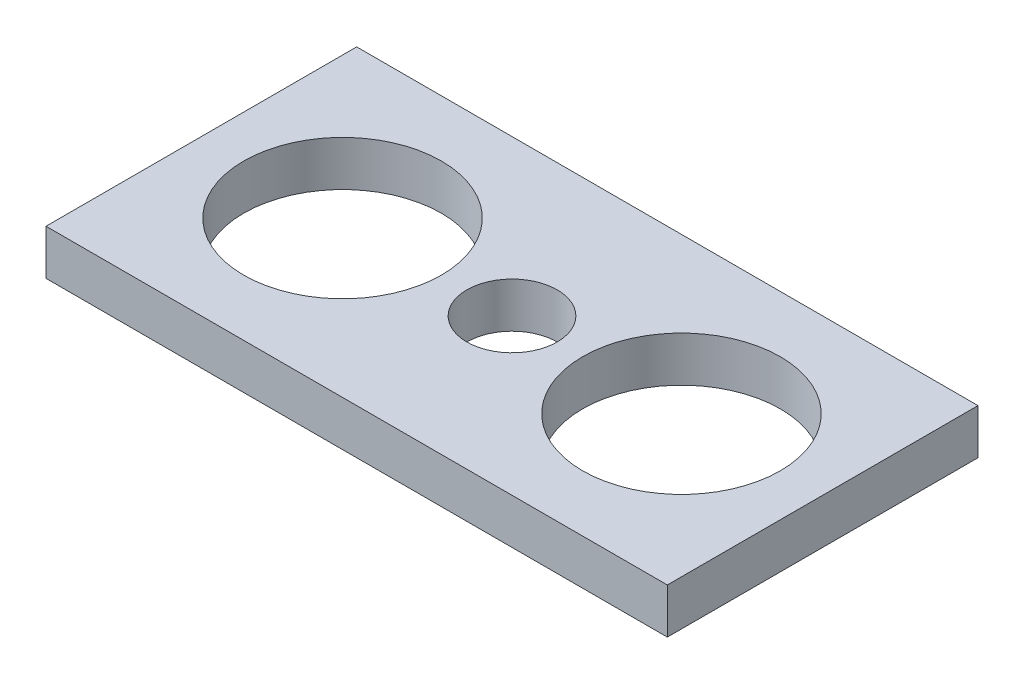
ISO-10303-21;
HEADER;
FILE_DESCRIPTION(('STEP AP214'),'2;1');
FILE_NAME('part.step','',(''),(''),'','','');
FILE_SCHEMA(('AUTOMOTIVE_DESIGN { 1 0 10303 214 1 1 1 1 }'));
ENDSEC;
DATA;
#1=APPLICATION_CONTEXT('core data for automotive mechanical design processes');
#2=APPLICATION_PROTOCOL_DEFINITION('international standard','automotive_design',2000,#1);
#3=PRODUCT_CONTEXT('',#1,'mechanical');
#4=PRODUCT('Part','Part','',(#3));
#5=PRODUCT_RELATED_PRODUCT_CATEGORY('part','',(#4));
#6=PRODUCT_DEFINITION_FORMATION('','',#4);
#7=PRODUCT_DEFINITION_CONTEXT('part definition',#1,'design');
#8=PRODUCT_DEFINITION('design','',#6,#7);
#9=PRODUCT_DEFINITION_SHAPE('','',#8);
#10=(LENGTH_UNIT() NAMED_UNIT(*) SI_UNIT(.MILLI.,.METRE.));
#11=(NAMED_UNIT(*) PLANE_ANGLE_UNIT() SI_UNIT($,.RADIAN.));
#12=(NAMED_UNIT(*) SI_UNIT($,.STERADIAN.) SOLID_ANGLE_UNIT());
#13=UNCERTAINTY_MEASURE_WITH_UNIT(LENGTH_MEASURE(1.E-05),#10,'distance_accuracy_value','');
#14=(GEOMETRIC_REPRESENTATION_CONTEXT(3) GLOBAL_UNCERTAINTY_ASSIGNED_CONTEXT((#13)) GLOBAL_UNIT_ASSIGNED_CONTEXT((#10,
#11,#12)) REPRESENTATION_CONTEXT('',''));
#15=CARTESIAN_POINT('',(0.,0.,0.));
#16=DIRECTION('',(0.,0.,1.));
#17=DIRECTION('',(1.,0.,0.));
#18=AXIS2_PLACEMENT_3D('',#15,#16,#17);
#19=CARTESIAN_POINT('',(0.,16.,-110.));
#20=DIRECTION('',(0.,-1.,0.));
#21=DIRECTION('',(0.,0.,-1.));
#22=AXIS2_PLACEMENT_3D('',#19,#20,#21);
#23=PLANE('',#22);
#24=CARTESIAN_POINT('',(170.,16.,-55.));
#25=DIRECTION('',(0.,1.,0.));
#26=DIRECTION('',(0.,0.,1.));
#27=AXIS2_PLACEMENT_3D('',#24,#25,#26);
#28=CIRCLE('',#27,35.);
#29=CARTESIAN_POINT('',(170.,16.,-20.));
#30=VERTEX_POINT('',#29);
#31=EDGE_CURVE('E114',#30,#30,#28,.T.);
#32=ORIENTED_EDGE('',*,*,#31,.F.);
#33=EDGE_LOOP('',(#32));
#34=FACE_BOUND('',#33,.T.);
#35=DIRECTION('',(0.,0.,1.));
#36=VECTOR('',#35,1.);
#37=CARTESIAN_POINT('',(0.,16.,0.));
#38=LINE('',#37,#36);
#39=CARTESIAN_POINT('',(0.,16.,-110.));
#40=VERTEX_POINT('',#39);
#41=CARTESIAN_POINT('',(0.,16.,0.));
#42=VERTEX_POINT('',#41);
#43=EDGE_CURVE('E84',#40,#42,#38,.T.);
#44=ORIENTED_EDGE('',*,*,#43,.T.);
#45=DIRECTION('',(1.,0.,0.));
#46=VECTOR('',#45,1.);
#47=CARTESIAN_POINT('',(0.,16.,0.));
#48=LINE('',#47,#46);
#49=CARTESIAN_POINT('',(220.,16.,0.));
#50=VERTEX_POINT('',#49);
#51=EDGE_CURVE('E79',#42,#50,#48,.T.);
#52=ORIENTED_EDGE('',*,*,#51,.T.);
#53=DIRECTION('',(0.,0.,-1.));
#54=VECTOR('',#53,1.);
#55=CARTESIAN_POINT('',(220.,16.,0.));
#56=LINE('',#55,#54);
#57=CARTESIAN_POINT('',(220.,16.,-110.));
#58=VERTEX_POINT('',#57);
#59=EDGE_CURVE('E82',#50,#58,#56,.T.);
#60=ORIENTED_EDGE('',*,*,#59,.T.);
#61=DIRECTION('',(-1.,0.,0.));
#62=VECTOR('',#61,1.);
#63=CARTESIAN_POINT('',(0.,16.,-110.));
#64=LINE('',#63,#62);
#65=EDGE_CURVE('E49',#58,#40,#64,.T.);
#66=ORIENTED_EDGE('',*,*,#65,.T.);
#67=EDGE_LOOP('',(#44,#52,#60,#66));
#68=FACE_BOUND('',#67,.T.);
#69=CARTESIAN_POINT('',(50.,16.,-55.));
#70=DIRECTION('',(0.,1.,0.));
#71=DIRECTION('',(0.,0.,1.));
#72=AXIS2_PLACEMENT_3D('',#69,#70,#71);
#73=CIRCLE('',#72,35.);
#74=CARTESIAN_POINT('',(50.,16.,-20.));
#75=VERTEX_POINT('',#74);
#76=EDGE_CURVE('E99',#75,#75,#73,.T.);
#77=ORIENTED_EDGE('',*,*,#76,.F.);
#78=EDGE_LOOP('',(#77));
#79=FACE_BOUND('',#78,.T.);
#80=CARTESIAN_POINT('',(110.,16.,-55.));
#81=DIRECTION('',(0.,1.,0.));
#82=DIRECTION('',(0.,0.,1.));
#83=AXIS2_PLACEMENT_3D('',#80,#81,#82);
#84=CIRCLE('',#83,16.);
#85=CARTESIAN_POINT('',(110.,16.,-39.));
#86=VERTEX_POINT('',#85);
#87=EDGE_CURVE('E120',#86,#86,#84,.T.);
#88=ORIENTED_EDGE('',*,*,#87,.F.);
#89=EDGE_LOOP('',(#88));
#90=FACE_BOUND('',#89,.T.);
#91=ADVANCED_FACE('F32',(#34,#68,#79,#90),#23,.F.);
#92=CARTESIAN_POINT('',(0.,0.,-110.));
#93=DIRECTION('',(0.,-1.,0.));
#94=DIRECTION('',(0.,0.,-1.));
#95=AXIS2_PLACEMENT_3D('',#92,#93,#94);
#96=PLANE('',#95);
#97=CARTESIAN_POINT('',(170.,0.,-55.));
#98=DIRECTION('',(0.,1.,0.));
#99=DIRECTION('',(0.,0.,1.));
#100=AXIS2_PLACEMENT_3D('',#97,#98,#99);
#101=CIRCLE('',#100,35.);
#102=CARTESIAN_POINT('',(170.,0.,-20.));
#103=VERTEX_POINT('',#102);
#104=EDGE_CURVE('E117',#103,#103,#101,.T.);
#105=ORIENTED_EDGE('',*,*,#104,.T.);
#106=EDGE_LOOP('',(#105));
#107=FACE_BOUND('',#106,.T.);
#108=DIRECTION('',(0.,0.,1.));
#109=VECTOR('',#108,1.);
#110=CARTESIAN_POINT('',(0.,0.,0.));
#111=LINE('',#110,#109);
#112=CARTESIAN_POINT('',(0.,0.,-110.));
#113=VERTEX_POINT('',#112);
#114=CARTESIAN_POINT('',(0.,0.,0.));
#115=VERTEX_POINT('',#114);
#116=EDGE_CURVE('E96',#113,#115,#111,.T.);
#117=ORIENTED_EDGE('',*,*,#116,.F.);
#118=DIRECTION('',(-1.,0.,0.));
#119=VECTOR('',#118,1.);
#120=CARTESIAN_POINT('',(0.,0.,-110.));
#121=LINE('',#120,#119);
#122=CARTESIAN_POINT('',(220.,0.,-110.));
#123=VERTEX_POINT('',#122);
#124=EDGE_CURVE('E72',#123,#113,#121,.T.);
#125=ORIENTED_EDGE('',*,*,#124,.F.);
#126=DIRECTION('',(0.,0.,-1.));
#127=VECTOR('',#126,1.);
#128=CARTESIAN_POINT('',(220.,0.,0.));
#129=LINE('',#128,#127);
#130=CARTESIAN_POINT('',(220.,0.,0.));
#131=VERTEX_POINT('',#130);
#132=EDGE_CURVE('E66',#131,#123,#129,.T.);
#133=ORIENTED_EDGE('',*,*,#132,.F.);
#134=DIRECTION('',(1.,0.,0.));
#135=VECTOR('',#134,1.);
#136=CARTESIAN_POINT('',(0.,0.,0.));
#137=LINE('',#136,#135);
#138=EDGE_CURVE('E88',#115,#131,#137,.T.);
#139=ORIENTED_EDGE('',*,*,#138,.F.);
#140=EDGE_LOOP('',(#117,#125,#133,#139));
#141=FACE_BOUND('',#140,.T.);
#142=CARTESIAN_POINT('',(50.,0.,-55.));
#143=DIRECTION('',(0.,1.,0.));
#144=DIRECTION('',(0.,0.,1.));
#145=AXIS2_PLACEMENT_3D('',#142,#143,#144);
#146=CIRCLE('',#145,35.);
#147=CARTESIAN_POINT('',(50.,0.,-20.));
#148=VERTEX_POINT('',#147);
#149=EDGE_CURVE('E111',#148,#148,#146,.T.);
#150=ORIENTED_EDGE('',*,*,#149,.T.);
#151=EDGE_LOOP('',(#150));
#152=FACE_BOUND('',#151,.T.);
#153=CARTESIAN_POINT('',(110.,0.,-55.));
#154=DIRECTION('',(0.,1.,0.));
#155=DIRECTION('',(0.,0.,1.));
#156=AXIS2_PLACEMENT_3D('',#153,#154,#155);
#157=CIRCLE('',#156,16.);
#158=CARTESIAN_POINT('',(110.,0.,-39.));
#159=VERTEX_POINT('',#158);
#160=EDGE_CURVE('E123',#159,#159,#157,.T.);
#161=ORIENTED_EDGE('',*,*,#160,.T.);
#162=EDGE_LOOP('',(#161));
#163=FACE_BOUND('',#162,.T.);
#164=ADVANCED_FACE('F107',(#107,#141,#152,#163),#96,.T.);
#165=CARTESIAN_POINT('',(0.,16.,0.));
#166=DIRECTION('',(1.,0.,0.));
#167=DIRECTION('',(0.,0.,-1.));
#168=AXIS2_PLACEMENT_3D('',#165,#166,#167);
#169=PLANE('',#168);
#170=ORIENTED_EDGE('',*,*,#116,.T.);
#171=DIRECTION('',(0.,-1.,0.));
#172=VECTOR('',#171,1.);
#173=CARTESIAN_POINT('',(0.,16.,0.));
#174=LINE('',#173,#172);
#175=EDGE_CURVE('E11',#42,#115,#174,.T.);
#176=ORIENTED_EDGE('',*,*,#175,.F.);
#177=ORIENTED_EDGE('',*,*,#43,.F.);
#178=DIRECTION('',(0.,-1.,0.));
#179=VECTOR('',#178,1.);
#180=CARTESIAN_POINT('',(0.,16.,-110.));
#181=LINE('',#180,#179);
#182=EDGE_CURVE('E92',#40,#113,#181,.T.);
#183=ORIENTED_EDGE('',*,*,#182,.T.);
#184=EDGE_LOOP('',(#170,#176,#177,#183));
#185=FACE_BOUND('',#184,.T.);
#186=ADVANCED_FACE('F34',(#185),#169,.F.);
#187=CARTESIAN_POINT('',(0.,16.,0.));
#188=DIRECTION('',(0.,0.,-1.));
#189=DIRECTION('',(-1.,0.,0.));
#190=AXIS2_PLACEMENT_3D('',#187,#188,#189);
#191=PLANE('',#190);
#192=ORIENTED_EDGE('',*,*,#138,.T.);
#193=DIRECTION('',(0.,-1.,0.));
#194=VECTOR('',#193,1.);
#195=CARTESIAN_POINT('',(220.,16.,0.));
#196=LINE('',#195,#194);
#197=EDGE_CURVE('E41',#50,#131,#196,.T.);
#198=ORIENTED_EDGE('',*,*,#197,.F.);
#199=ORIENTED_EDGE('',*,*,#51,.F.);
#200=ORIENTED_EDGE('',*,*,#175,.T.);
#201=EDGE_LOOP('',(#192,#198,#199,#200));
#202=FACE_BOUND('',#201,.T.);
#203=ADVANCED_FACE('F87',(#202),#191,.F.);
#204=CARTESIAN_POINT('',(220.,16.,0.));
#205=DIRECTION('',(-1.,0.,0.));
#206=DIRECTION('',(0.,0.,1.));
#207=AXIS2_PLACEMENT_3D('',#204,#205,#206);
#208=PLANE('',#207);
#209=ORIENTED_EDGE('',*,*,#132,.T.);
#210=DIRECTION('',(0.,-1.,0.));
#211=VECTOR('',#210,1.);
#212=CARTESIAN_POINT('',(220.,16.,-110.));
#213=LINE('',#212,#211);
#214=EDGE_CURVE('E89',#58,#123,#213,.T.);
#215=ORIENTED_EDGE('',*,*,#214,.F.);
#216=ORIENTED_EDGE('',*,*,#59,.F.);
#217=ORIENTED_EDGE('',*,*,#197,.T.);
#218=EDGE_LOOP('',(#209,#215,#216,#217));
#219=FACE_BOUND('',#218,.T.);
#220=ADVANCED_FACE('F90',(#219),#208,.F.);
#221=CARTESIAN_POINT('',(0.,16.,-110.));
#222=DIRECTION('',(0.,0.,1.));
#223=DIRECTION('',(1.,0.,0.));
#224=AXIS2_PLACEMENT_3D('',#221,#222,#223);
#225=PLANE('',#224);
#226=ORIENTED_EDGE('',*,*,#124,.T.);
#227=ORIENTED_EDGE('',*,*,#182,.F.);
#228=ORIENTED_EDGE('',*,*,#65,.F.);
#229=ORIENTED_EDGE('',*,*,#214,.T.);
#230=EDGE_LOOP('',(#226,#227,#228,#229));
#231=FACE_BOUND('',#230,.T.);
#232=ADVANCED_FACE('F104',(#231),#225,.F.);
#233=CARTESIAN_POINT('',(50.,16.,-55.));
#234=DIRECTION('',(0.,-1.,0.));
#235=DIRECTION('',(0.,0.,-1.));
#236=AXIS2_PLACEMENT_3D('',#233,#234,#235);
#237=CYLINDRICAL_SURFACE('',#236,35.);
#238=ORIENTED_EDGE('',*,*,#76,.T.);
#239=EDGE_LOOP('',(#238));
#240=FACE_BOUND('',#239,.T.);
#241=ORIENTED_EDGE('',*,*,#149,.F.);
#242=EDGE_LOOP('',(#241));
#243=FACE_BOUND('',#242,.T.);
#244=ADVANCED_FACE('F142',(#240,#243),#237,.F.);
#245=CARTESIAN_POINT('',(170.,16.,-55.));
#246=DIRECTION('',(0.,-1.,0.));
#247=DIRECTION('',(0.,0.,-1.));
#248=AXIS2_PLACEMENT_3D('',#245,#246,#247);
#249=CYLINDRICAL_SURFACE('',#248,35.);
#250=ORIENTED_EDGE('',*,*,#31,.T.);
#251=EDGE_LOOP('',(#250));
#252=FACE_BOUND('',#251,.T.);
#253=ORIENTED_EDGE('',*,*,#104,.F.);
#254=EDGE_LOOP('',(#253));
#255=FACE_BOUND('',#254,.T.);
#256=ADVANCED_FACE('F188',(#252,#255),#249,.F.);
#257=CARTESIAN_POINT('',(110.,16.,-55.));
#258=DIRECTION('',(0.,-1.,0.));
#259=DIRECTION('',(0.,0.,-1.));
#260=AXIS2_PLACEMENT_3D('',#257,#258,#259);
#261=CYLINDRICAL_SURFACE('',#260,16.);
#262=ORIENTED_EDGE('',*,*,#87,.T.);
#263=EDGE_LOOP('',(#262));
#264=FACE_BOUND('',#263,.T.);
#265=ORIENTED_EDGE('',*,*,#160,.F.);
#266=EDGE_LOOP('',(#265));
#267=FACE_BOUND('',#266,.T.);
#268=ADVANCED_FACE('F129',(#264,#267),#261,.F.);
#269=CLOSED_SHELL('',(#91,#164,#186,#203,#220,#232,#244,#256,#268));
#270=MANIFOLD_SOLID_BREP('B2',#269);
#271=ADVANCED_BREP_SHAPE_REPRESENTATION('',(#18,#270),#14);
#272=SHAPE_DEFINITION_REPRESENTATION(#9,#271);
ENDSEC;
END-ISO-10303-21;
